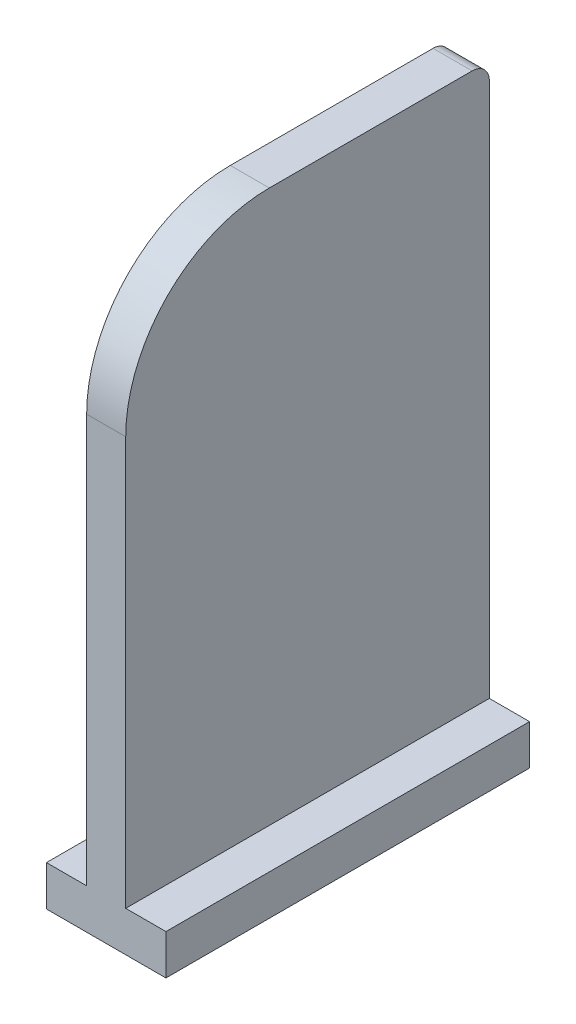
ISO-10303-21;
HEADER;
FILE_DESCRIPTION(('STEP AP214'),'2;1');
FILE_NAME('part.step','',(''),(''),'','','');
FILE_SCHEMA(('AUTOMOTIVE_DESIGN { 1 0 10303 214 1 1 1 1 }'));
ENDSEC;
DATA;
#1=APPLICATION_CONTEXT('core data for automotive mechanical design processes');
#2=APPLICATION_PROTOCOL_DEFINITION('international standard','automotive_design',2000,#1);
#3=PRODUCT_CONTEXT('',#1,'mechanical');
#4=PRODUCT('Part','Part','',(#3));
#5=PRODUCT_RELATED_PRODUCT_CATEGORY('part','',(#4));
#6=PRODUCT_DEFINITION_FORMATION('','',#4);
#7=PRODUCT_DEFINITION_CONTEXT('part definition',#1,'design');
#8=PRODUCT_DEFINITION('design','',#6,#7);
#9=PRODUCT_DEFINITION_SHAPE('','',#8);
#10=(LENGTH_UNIT() NAMED_UNIT(*) SI_UNIT(.MILLI.,.METRE.));
#11=(NAMED_UNIT(*) PLANE_ANGLE_UNIT() SI_UNIT($,.RADIAN.));
#12=(NAMED_UNIT(*) SI_UNIT($,.STERADIAN.) SOLID_ANGLE_UNIT());
#13=UNCERTAINTY_MEASURE_WITH_UNIT(LENGTH_MEASURE(1.E-05),#10,'distance_accuracy_value','');
#14=(GEOMETRIC_REPRESENTATION_CONTEXT(3) GLOBAL_UNCERTAINTY_ASSIGNED_CONTEXT((#13)) GLOBAL_UNIT_ASSIGNED_CONTEXT((#10,
#11,#12)) REPRESENTATION_CONTEXT('',''));
#15=CARTESIAN_POINT('',(0.,0.,0.));
#16=DIRECTION('',(0.,0.,1.));
#17=DIRECTION('',(1.,0.,0.));
#18=AXIS2_PLACEMENT_3D('',#15,#16,#17);
#19=CARTESIAN_POINT('',(0.,0.,63.3));
#20=DIRECTION('',(1.,0.,0.));
#21=DIRECTION('',(0.,0.,-1.));
#22=AXIS2_PLACEMENT_3D('',#19,#20,#21);
#23=PLANE('',#22);
#24=DIRECTION('',(0.,-1.,0.));
#25=VECTOR('',#24,1.);
#26=CARTESIAN_POINT('',(0.,0.,0.));
#27=LINE('',#26,#25);
#28=CARTESIAN_POINT('',(0.,7.,0.));
#29=VERTEX_POINT('',#28);
#30=CARTESIAN_POINT('',(0.,0.,0.));
#31=VERTEX_POINT('',#30);
#32=EDGE_CURVE('E147',#29,#31,#27,.T.);
#33=ORIENTED_EDGE('',*,*,#32,.T.);
#34=DIRECTION('',(0.,0.,-1.));
#35=VECTOR('',#34,1.);
#36=CARTESIAN_POINT('',(0.,0.,63.3));
#37=LINE('',#36,#35);
#38=CARTESIAN_POINT('',(0.,0.,63.3));
#39=VERTEX_POINT('',#38);
#40=EDGE_CURVE('E125',#39,#31,#37,.T.);
#41=ORIENTED_EDGE('',*,*,#40,.F.);
#42=DIRECTION('',(0.,-1.,0.));
#43=VECTOR('',#42,1.);
#44=CARTESIAN_POINT('',(0.,0.,63.3));
#45=LINE('',#44,#43);
#46=CARTESIAN_POINT('',(0.,7.,63.3));
#47=VERTEX_POINT('',#46);
#48=EDGE_CURVE('E133',#47,#39,#45,.T.);
#49=ORIENTED_EDGE('',*,*,#48,.F.);
#50=DIRECTION('',(0.,0.,-1.));
#51=VECTOR('',#50,1.);
#52=CARTESIAN_POINT('',(0.,7.,63.3));
#53=LINE('',#52,#51);
#54=EDGE_CURVE('E189',#47,#29,#53,.T.);
#55=ORIENTED_EDGE('',*,*,#54,.T.);
#56=EDGE_LOOP('',(#33,#41,#49,#55));
#57=FACE_BOUND('',#56,.T.);
#58=ADVANCED_FACE('F45',(#57),#23,.F.);
#59=CARTESIAN_POINT('',(0.,0.,63.3));
#60=DIRECTION('',(0.,1.,0.));
#61=DIRECTION('',(0.,0.,1.));
#62=AXIS2_PLACEMENT_3D('',#59,#60,#61);
#63=PLANE('',#62);
#64=DIRECTION('',(1.,0.,0.));
#65=VECTOR('',#64,1.);
#66=CARTESIAN_POINT('',(0.,0.,0.));
#67=LINE('',#66,#65);
#68=CARTESIAN_POINT('',(20.8,0.,0.));
#69=VERTEX_POINT('',#68);
#70=EDGE_CURVE('E197',#31,#69,#67,.T.);
#71=ORIENTED_EDGE('',*,*,#70,.T.);
#72=DIRECTION('',(0.,0.,-1.));
#73=VECTOR('',#72,1.);
#74=CARTESIAN_POINT('',(20.8,0.,63.3));
#75=LINE('',#74,#73);
#76=CARTESIAN_POINT('',(20.8,0.,63.3));
#77=VERTEX_POINT('',#76);
#78=EDGE_CURVE('E128',#77,#69,#75,.T.);
#79=ORIENTED_EDGE('',*,*,#78,.F.);
#80=DIRECTION('',(1.,0.,0.));
#81=VECTOR('',#80,1.);
#82=CARTESIAN_POINT('',(0.,0.,63.3));
#83=LINE('',#82,#81);
#84=EDGE_CURVE('E121',#39,#77,#83,.T.);
#85=ORIENTED_EDGE('',*,*,#84,.F.);
#86=ORIENTED_EDGE('',*,*,#40,.T.);
#87=EDGE_LOOP('',(#71,#79,#85,#86));
#88=FACE_BOUND('',#87,.T.);
#89=ADVANCED_FACE('F123',(#88),#63,.F.);
#90=CARTESIAN_POINT('',(20.8,0.,63.3));
#91=DIRECTION('',(-1.,0.,0.));
#92=DIRECTION('',(0.,0.,1.));
#93=AXIS2_PLACEMENT_3D('',#90,#91,#92);
#94=PLANE('',#93);
#95=DIRECTION('',(0.,1.,0.));
#96=VECTOR('',#95,1.);
#97=CARTESIAN_POINT('',(20.8,0.,0.));
#98=LINE('',#97,#96);
#99=CARTESIAN_POINT('',(20.8,7.,0.));
#100=VERTEX_POINT('',#99);
#101=EDGE_CURVE('E200',#69,#100,#98,.T.);
#102=ORIENTED_EDGE('',*,*,#101,.T.);
#103=DIRECTION('',(0.,0.,-1.));
#104=VECTOR('',#103,1.);
#105=CARTESIAN_POINT('',(20.8,7.,63.3));
#106=LINE('',#105,#104);
#107=CARTESIAN_POINT('',(20.8,7.,63.3));
#108=VERTEX_POINT('',#107);
#109=EDGE_CURVE('E156',#108,#100,#106,.T.);
#110=ORIENTED_EDGE('',*,*,#109,.F.);
#111=DIRECTION('',(0.,1.,0.));
#112=VECTOR('',#111,1.);
#113=CARTESIAN_POINT('',(20.8,0.,63.3));
#114=LINE('',#113,#112);
#115=EDGE_CURVE('E132',#77,#108,#114,.T.);
#116=ORIENTED_EDGE('',*,*,#115,.F.);
#117=ORIENTED_EDGE('',*,*,#78,.T.);
#118=EDGE_LOOP('',(#102,#110,#116,#117));
#119=FACE_BOUND('',#118,.T.);
#120=ADVANCED_FACE('F261',(#119),#94,.F.);
#121=CARTESIAN_POINT('',(13.8,7.,63.3));
#122=DIRECTION('',(0.,-1.,0.));
#123=DIRECTION('',(0.,0.,-1.));
#124=AXIS2_PLACEMENT_3D('',#121,#122,#123);
#125=PLANE('',#124);
#126=DIRECTION('',(-1.,0.,0.));
#127=VECTOR('',#126,1.);
#128=CARTESIAN_POINT('',(13.8,7.,0.));
#129=LINE('',#128,#127);
#130=CARTESIAN_POINT('',(13.8,7.,0.));
#131=VERTEX_POINT('',#130);
#132=EDGE_CURVE('E203',#100,#131,#129,.T.);
#133=ORIENTED_EDGE('',*,*,#132,.T.);
#134=DIRECTION('',(0.,0.,-1.));
#135=VECTOR('',#134,1.);
#136=CARTESIAN_POINT('',(13.8,7.,63.3));
#137=LINE('',#136,#135);
#138=CARTESIAN_POINT('',(13.8,7.,63.3));
#139=VERTEX_POINT('',#138);
#140=EDGE_CURVE('E226',#139,#131,#137,.T.);
#141=ORIENTED_EDGE('',*,*,#140,.F.);
#142=DIRECTION('',(-1.,0.,0.));
#143=VECTOR('',#142,1.);
#144=CARTESIAN_POINT('',(13.8,7.,63.3));
#145=LINE('',#144,#143);
#146=EDGE_CURVE('E191',#108,#139,#145,.T.);
#147=ORIENTED_EDGE('',*,*,#146,.F.);
#148=ORIENTED_EDGE('',*,*,#109,.T.);
#149=EDGE_LOOP('',(#133,#141,#147,#148));
#150=FACE_BOUND('',#149,.T.);
#151=ADVANCED_FACE('F235',(#150),#125,.F.);
#152=CARTESIAN_POINT('',(13.8,18.1071289102514,63.3));
#153=DIRECTION('',(-1.,0.,0.));
#154=DIRECTION('',(0.,0.,1.));
#155=AXIS2_PLACEMENT_3D('',#152,#153,#154);
#156=PLANE('',#155);
#157=DIRECTION('',(0.,0.,-1.));
#158=VECTOR('',#157,1.);
#159=CARTESIAN_POINT('',(13.8,103.1,63.3));
#160=LINE('',#159,#158);
#161=CARTESIAN_POINT('',(13.8,103.1,38.3));
#162=VERTEX_POINT('',#161);
#163=CARTESIAN_POINT('',(13.8,103.1,3.));
#164=VERTEX_POINT('',#163);
#165=EDGE_CURVE('E223',#162,#164,#160,.T.);
#166=ORIENTED_EDGE('',*,*,#165,.F.);
#167=CARTESIAN_POINT('',(13.8,78.1,38.3));
#168=DIRECTION('',(-1.,0.,0.));
#169=DIRECTION('',(0.,0.,1.));
#170=AXIS2_PLACEMENT_3D('',#167,#168,#169);
#171=CIRCLE('',#170,25.);
#172=CARTESIAN_POINT('',(13.8,78.1,63.3));
#173=VERTEX_POINT('',#172);
#174=EDGE_CURVE('E11',#162,#173,#171,.F.);
#175=ORIENTED_EDGE('',*,*,#174,.T.);
#176=DIRECTION('',(0.,1.,0.));
#177=VECTOR('',#176,1.);
#178=CARTESIAN_POINT('',(13.8,7.,63.3));
#179=LINE('',#178,#177);
#180=EDGE_CURVE('E179',#139,#173,#179,.T.);
#181=ORIENTED_EDGE('',*,*,#180,.F.);
#182=ORIENTED_EDGE('',*,*,#140,.T.);
#183=DIRECTION('',(0.,1.,0.));
#184=VECTOR('',#183,1.);
#185=CARTESIAN_POINT('',(13.8,18.1071289102514,0.));
#186=LINE('',#185,#184);
#187=CARTESIAN_POINT('',(13.8,100.1,0.));
#188=VERTEX_POINT('',#187);
#189=EDGE_CURVE('E207',#131,#188,#186,.T.);
#190=ORIENTED_EDGE('',*,*,#189,.T.);
#191=CARTESIAN_POINT('',(13.8,100.1,3.));
#192=DIRECTION('',(-1.,0.,0.));
#193=DIRECTION('',(0.,0.,1.));
#194=AXIS2_PLACEMENT_3D('',#191,#192,#193);
#195=CIRCLE('',#194,3.);
#196=EDGE_CURVE('E165',#188,#164,#195,.F.);
#197=ORIENTED_EDGE('',*,*,#196,.T.);
#198=EDGE_LOOP('',(#166,#175,#181,#182,#190,#197));
#199=FACE_BOUND('',#198,.T.);
#200=ADVANCED_FACE('F245',(#199),#156,.F.);
#201=CARTESIAN_POINT('',(7.,103.1,63.3));
#202=DIRECTION('',(0.,-1.,0.));
#203=DIRECTION('',(0.,0.,-1.));
#204=AXIS2_PLACEMENT_3D('',#201,#202,#203);
#205=PLANE('',#204);
#206=DIRECTION('',(0.,0.,-1.));
#207=VECTOR('',#206,1.);
#208=CARTESIAN_POINT('',(7.,103.1,63.3));
#209=LINE('',#208,#207);
#210=CARTESIAN_POINT('',(7.,103.1,38.3));
#211=VERTEX_POINT('',#210);
#212=CARTESIAN_POINT('',(7.,103.1,3.));
#213=VERTEX_POINT('',#212);
#214=EDGE_CURVE('E220',#211,#213,#209,.T.);
#215=ORIENTED_EDGE('',*,*,#214,.F.);
#216=DIRECTION('',(-1.,0.,0.));
#217=VECTOR('',#216,1.);
#218=CARTESIAN_POINT('',(7.,103.1,38.3));
#219=LINE('',#218,#217);
#220=EDGE_CURVE('E54',#211,#162,#219,.F.);
#221=ORIENTED_EDGE('',*,*,#220,.T.);
#222=ORIENTED_EDGE('',*,*,#165,.T.);
#223=DIRECTION('',(-1.,0.,0.));
#224=VECTOR('',#223,1.);
#225=CARTESIAN_POINT('',(7.,103.1,3.));
#226=LINE('',#225,#224);
#227=EDGE_CURVE('E149',#164,#213,#226,.T.);
#228=ORIENTED_EDGE('',*,*,#227,.T.);
#229=EDGE_LOOP('',(#215,#221,#222,#228));
#230=FACE_BOUND('',#229,.T.);
#231=ADVANCED_FACE('F250',(#230),#205,.F.);
#232=CARTESIAN_POINT('',(7.,7.,63.3));
#233=DIRECTION('',(1.,0.,0.));
#234=DIRECTION('',(0.,0.,-1.));
#235=AXIS2_PLACEMENT_3D('',#232,#233,#234);
#236=PLANE('',#235);
#237=DIRECTION('',(0.,-1.,0.));
#238=VECTOR('',#237,1.);
#239=CARTESIAN_POINT('',(7.,18.1071289102514,63.3));
#240=LINE('',#239,#238);
#241=CARTESIAN_POINT('',(7.,78.1,63.3));
#242=VERTEX_POINT('',#241);
#243=CARTESIAN_POINT('',(7.,7.,63.3));
#244=VERTEX_POINT('',#243);
#245=EDGE_CURVE('E176',#242,#244,#240,.T.);
#246=ORIENTED_EDGE('',*,*,#245,.F.);
#247=CARTESIAN_POINT('',(7.,78.1,38.3));
#248=DIRECTION('',(1.,0.,0.));
#249=DIRECTION('',(0.,0.,-1.));
#250=AXIS2_PLACEMENT_3D('',#247,#248,#249);
#251=CIRCLE('',#250,25.);
#252=EDGE_CURVE('E68',#242,#211,#251,.F.);
#253=ORIENTED_EDGE('',*,*,#252,.T.);
#254=ORIENTED_EDGE('',*,*,#214,.T.);
#255=CARTESIAN_POINT('',(7.,100.1,3.));
#256=DIRECTION('',(1.,0.,0.));
#257=DIRECTION('',(0.,0.,-1.));
#258=AXIS2_PLACEMENT_3D('',#255,#256,#257);
#259=CIRCLE('',#258,3.);
#260=CARTESIAN_POINT('',(7.,100.1,0.));
#261=VERTEX_POINT('',#260);
#262=EDGE_CURVE('E154',#213,#261,#259,.F.);
#263=ORIENTED_EDGE('',*,*,#262,.T.);
#264=DIRECTION('',(0.,-1.,0.));
#265=VECTOR('',#264,1.);
#266=CARTESIAN_POINT('',(7.,7.,0.));
#267=LINE('',#266,#265);
#268=CARTESIAN_POINT('',(7.,7.,0.));
#269=VERTEX_POINT('',#268);
#270=EDGE_CURVE('E211',#261,#269,#267,.T.);
#271=ORIENTED_EDGE('',*,*,#270,.T.);
#272=DIRECTION('',(0.,0.,-1.));
#273=VECTOR('',#272,1.);
#274=CARTESIAN_POINT('',(7.,7.,63.3));
#275=LINE('',#274,#273);
#276=EDGE_CURVE('E184',#244,#269,#275,.T.);
#277=ORIENTED_EDGE('',*,*,#276,.F.);
#278=EDGE_LOOP('',(#246,#253,#254,#263,#271,#277));
#279=FACE_BOUND('',#278,.T.);
#280=ADVANCED_FACE('F182',(#279),#236,.F.);
#281=CARTESIAN_POINT('',(0.,7.,63.3));
#282=DIRECTION('',(0.,-1.,0.));
#283=DIRECTION('',(0.,0.,-1.));
#284=AXIS2_PLACEMENT_3D('',#281,#282,#283);
#285=PLANE('',#284);
#286=DIRECTION('',(-1.,0.,0.));
#287=VECTOR('',#286,1.);
#288=CARTESIAN_POINT('',(0.,7.,0.));
#289=LINE('',#288,#287);
#290=EDGE_CURVE('E144',#269,#29,#289,.T.);
#291=ORIENTED_EDGE('',*,*,#290,.T.);
#292=ORIENTED_EDGE('',*,*,#54,.F.);
#293=DIRECTION('',(-1.,0.,0.));
#294=VECTOR('',#293,1.);
#295=CARTESIAN_POINT('',(0.,7.,63.3));
#296=LINE('',#295,#294);
#297=EDGE_CURVE('E139',#244,#47,#296,.T.);
#298=ORIENTED_EDGE('',*,*,#297,.F.);
#299=ORIENTED_EDGE('',*,*,#276,.T.);
#300=EDGE_LOOP('',(#291,#292,#298,#299));
#301=FACE_BOUND('',#300,.T.);
#302=ADVANCED_FACE('F274',(#301),#285,.F.);
#303=CARTESIAN_POINT('',(0.,0.,63.3));
#304=DIRECTION('',(0.,0.,-1.));
#305=DIRECTION('',(-1.,0.,0.));
#306=AXIS2_PLACEMENT_3D('',#303,#304,#305);
#307=PLANE('',#306);
#308=ORIENTED_EDGE('',*,*,#180,.T.);
#309=DIRECTION('',(-1.,0.,0.));
#310=VECTOR('',#309,1.);
#311=CARTESIAN_POINT('',(0.,78.1,63.3));
#312=LINE('',#311,#310);
#313=EDGE_CURVE('E169',#173,#242,#312,.T.);
#314=ORIENTED_EDGE('',*,*,#313,.T.);
#315=ORIENTED_EDGE('',*,*,#245,.T.);
#316=ORIENTED_EDGE('',*,*,#297,.T.);
#317=ORIENTED_EDGE('',*,*,#48,.T.);
#318=ORIENTED_EDGE('',*,*,#84,.T.);
#319=ORIENTED_EDGE('',*,*,#115,.T.);
#320=ORIENTED_EDGE('',*,*,#146,.T.);
#321=EDGE_LOOP('',(#308,#314,#315,#316,#317,#318,#319,#320));
#322=FACE_BOUND('',#321,.T.);
#323=ADVANCED_FACE('F137',(#322),#307,.F.);
#324=CARTESIAN_POINT('',(0.,0.,0.));
#325=DIRECTION('',(0.,0.,-1.));
#326=DIRECTION('',(-1.,0.,0.));
#327=AXIS2_PLACEMENT_3D('',#324,#325,#326);
#328=PLANE('',#327);
#329=ORIENTED_EDGE('',*,*,#270,.F.);
#330=DIRECTION('',(-1.,0.,0.));
#331=VECTOR('',#330,1.);
#332=CARTESIAN_POINT('',(13.8,100.1,0.));
#333=LINE('',#332,#331);
#334=EDGE_CURVE('E162',#261,#188,#333,.F.);
#335=ORIENTED_EDGE('',*,*,#334,.T.);
#336=ORIENTED_EDGE('',*,*,#189,.F.);
#337=ORIENTED_EDGE('',*,*,#132,.F.);
#338=ORIENTED_EDGE('',*,*,#101,.F.);
#339=ORIENTED_EDGE('',*,*,#70,.F.);
#340=ORIENTED_EDGE('',*,*,#32,.F.);
#341=ORIENTED_EDGE('',*,*,#290,.F.);
#342=EDGE_LOOP('',(#329,#335,#336,#337,#338,#339,#340,#341));
#343=FACE_BOUND('',#342,.T.);
#344=ADVANCED_FACE('F241',(#343),#328,.T.);
#345=CARTESIAN_POINT('',(7.,100.1,3.));
#346=DIRECTION('',(1.,0.,0.));
#347=DIRECTION('',(0.,0.,-1.));
#348=AXIS2_PLACEMENT_3D('',#345,#346,#347);
#349=CYLINDRICAL_SURFACE('',#348,3.);
#350=ORIENTED_EDGE('',*,*,#196,.F.);
#351=ORIENTED_EDGE('',*,*,#334,.F.);
#352=ORIENTED_EDGE('',*,*,#262,.F.);
#353=ORIENTED_EDGE('',*,*,#227,.F.);
#354=EDGE_LOOP('',(#350,#351,#352,#353));
#355=FACE_BOUND('',#354,.T.);
#356=ADVANCED_FACE('F248',(#355),#349,.T.);
#357=CARTESIAN_POINT('',(0.,78.1,38.3));
#358=DIRECTION('',(-1.,0.,0.));
#359=DIRECTION('',(0.,0.,1.));
#360=AXIS2_PLACEMENT_3D('',#357,#358,#359);
#361=CYLINDRICAL_SURFACE('',#360,25.);
#362=ORIENTED_EDGE('',*,*,#174,.F.);
#363=ORIENTED_EDGE('',*,*,#220,.F.);
#364=ORIENTED_EDGE('',*,*,#252,.F.);
#365=ORIENTED_EDGE('',*,*,#313,.F.);
#366=EDGE_LOOP('',(#362,#363,#364,#365));
#367=FACE_BOUND('',#366,.T.);
#368=ADVANCED_FACE('F47',(#367),#361,.T.);
#369=CLOSED_SHELL('',(#58,#89,#120,#151,#200,#231,#280,#302,#323,#344,#356,#368));
#370=MANIFOLD_SOLID_BREP('B2',#369);
#371=ADVANCED_BREP_SHAPE_REPRESENTATION('',(#18,#370),#14);
#372=SHAPE_DEFINITION_REPRESENTATION(#9,#371);
ENDSEC;
END-ISO-10303-21;
